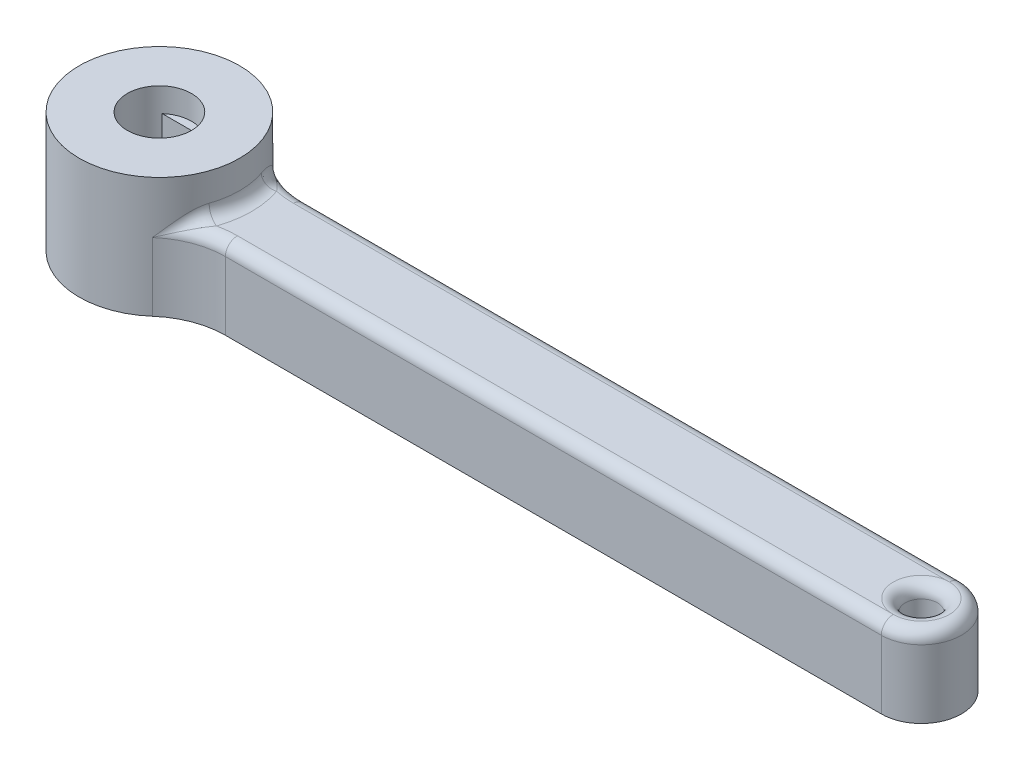
ISO-10303-21;
HEADER;
FILE_DESCRIPTION(('STEP AP214'),'2;1');
FILE_NAME('part.step','',(''),(''),'','','');
FILE_SCHEMA(('AUTOMOTIVE_DESIGN { 1 0 10303 214 1 1 1 1 }'));
ENDSEC;
DATA;
#1=APPLICATION_CONTEXT('core data for automotive mechanical design processes');
#2=APPLICATION_PROTOCOL_DEFINITION('international standard','automotive_design',2000,#1);
#3=PRODUCT_CONTEXT('',#1,'mechanical');
#4=PRODUCT('Part','Part','',(#3));
#5=PRODUCT_RELATED_PRODUCT_CATEGORY('part','',(#4));
#6=PRODUCT_DEFINITION_FORMATION('','',#4);
#7=PRODUCT_DEFINITION_CONTEXT('part definition',#1,'design');
#8=PRODUCT_DEFINITION('design','',#6,#7);
#9=PRODUCT_DEFINITION_SHAPE('','',#8);
#10=(LENGTH_UNIT() NAMED_UNIT(*) SI_UNIT(.MILLI.,.METRE.));
#11=(NAMED_UNIT(*) PLANE_ANGLE_UNIT() SI_UNIT($,.RADIAN.));
#12=(NAMED_UNIT(*) SI_UNIT($,.STERADIAN.) SOLID_ANGLE_UNIT());
#13=UNCERTAINTY_MEASURE_WITH_UNIT(LENGTH_MEASURE(1.E-05),#10,'distance_accuracy_value','');
#14=(GEOMETRIC_REPRESENTATION_CONTEXT(3) GLOBAL_UNCERTAINTY_ASSIGNED_CONTEXT((#13)) GLOBAL_UNIT_ASSIGNED_CONTEXT((#10,
#11,#12)) REPRESENTATION_CONTEXT('',''));
#15=CARTESIAN_POINT('',(0.,0.,0.));
#16=DIRECTION('',(0.,0.,1.));
#17=DIRECTION('',(1.,0.,0.));
#18=AXIS2_PLACEMENT_3D('',#15,#16,#17);
#19=CARTESIAN_POINT('',(0.,10.,-3.));
#20=DIRECTION('',(0.,0.,1.));
#21=DIRECTION('',(1.,0.,0.));
#22=AXIS2_PLACEMENT_3D('',#19,#20,#21);
#23=PLANE('',#22);
#24=DIRECTION('',(0.,-1.,0.));
#25=VECTOR('',#24,1.);
#26=CARTESIAN_POINT('',(2.64575131106459,10.,-3.));
#27=LINE('',#26,#25);
#28=CARTESIAN_POINT('',(2.64575131106459,12.,-3.));
#29=VERTEX_POINT('',#28);
#30=CARTESIAN_POINT('',(2.64575131106459,0.,-3.));
#31=VERTEX_POINT('',#30);
#32=EDGE_CURVE('E136',#29,#31,#27,.T.);
#33=ORIENTED_EDGE('',*,*,#32,.F.);
#34=DIRECTION('',(-1.,0.,0.));
#35=VECTOR('',#34,1.);
#36=CARTESIAN_POINT('',(0.,12.,-3.));
#37=LINE('',#36,#35);
#38=CARTESIAN_POINT('',(-2.64575131106459,12.,-3.));
#39=VERTEX_POINT('',#38);
#40=EDGE_CURVE('E123',#29,#39,#37,.T.);
#41=ORIENTED_EDGE('',*,*,#40,.T.);
#42=DIRECTION('',(0.,-1.,0.));
#43=VECTOR('',#42,1.);
#44=CARTESIAN_POINT('',(-2.64575131106459,10.,-3.));
#45=LINE('',#44,#43);
#46=CARTESIAN_POINT('',(-2.64575131106459,0.,-3.));
#47=VERTEX_POINT('',#46);
#48=EDGE_CURVE('E138',#39,#47,#45,.T.);
#49=ORIENTED_EDGE('',*,*,#48,.T.);
#50=DIRECTION('',(-1.,0.,0.));
#51=VECTOR('',#50,1.);
#52=CARTESIAN_POINT('',(0.,0.,-3.));
#53=LINE('',#52,#51);
#54=EDGE_CURVE('E141',#31,#47,#53,.T.);
#55=ORIENTED_EDGE('',*,*,#54,.F.);
#56=EDGE_LOOP('',(#33,#41,#49,#55));
#57=FACE_BOUND('',#56,.T.);
#58=ADVANCED_FACE('F35',(#57),#23,.T.);
#59=CARTESIAN_POINT('',(13.228756555323,10.,-15.));
#60=DIRECTION('',(0.,-1.,0.));
#61=DIRECTION('',(0.,0.,-1.));
#62=AXIS2_PLACEMENT_3D('',#59,#60,#61);
#63=PLANE('',#62);
#64=CARTESIAN_POINT('',(0.,10.,0.));
#65=DIRECTION('',(0.,-1.,0.));
#66=DIRECTION('',(0.,0.,-1.));
#67=AXIS2_PLACEMENT_3D('',#64,#65,#66);
#68=CIRCLE('',#67,11.5);
#69=CARTESIAN_POINT('',(10.8735595370117,10.,-3.74375519967082));
#70=VERTEX_POINT('',#69);
#71=CARTESIAN_POINT('',(10.8735595370117,10.,3.74375519967082));
#72=VERTEX_POINT('',#71);
#73=EDGE_CURVE('E188',#70,#72,#68,.T.);
#74=ORIENTED_EDGE('',*,*,#73,.T.);
#75=CARTESIAN_POINT('',(13.228756555323,10.,15.));
#76=DIRECTION('',(0.,-1.,0.));
#77=DIRECTION('',(0.,0.,-1.));
#78=AXIS2_PLACEMENT_3D('',#75,#76,#77);
#79=CIRCLE('',#78,11.5);
#80=CARTESIAN_POINT('',(13.228756555323,10.,3.5));
#81=VERTEX_POINT('',#80);
#82=EDGE_CURVE('E190',#72,#81,#79,.T.);
#83=ORIENTED_EDGE('',*,*,#82,.T.);
#84=DIRECTION('',(1.,0.,0.));
#85=VECTOR('',#84,1.);
#86=CARTESIAN_POINT('',(13.228756555323,10.,3.5));
#87=LINE('',#86,#85);
#88=CARTESIAN_POINT('',(95.,10.,3.5));
#89=VERTEX_POINT('',#88);
#90=EDGE_CURVE('E181',#81,#89,#87,.T.);
#91=ORIENTED_EDGE('',*,*,#90,.T.);
#92=CARTESIAN_POINT('',(95.,10.,0.));
#93=DIRECTION('',(0.,-1.,0.));
#94=DIRECTION('',(0.,0.,-1.));
#95=AXIS2_PLACEMENT_3D('',#92,#93,#94);
#96=CIRCLE('',#95,3.5);
#97=CARTESIAN_POINT('',(95.,10.,-3.5));
#98=VERTEX_POINT('',#97);
#99=EDGE_CURVE('E179',#89,#98,#96,.T.);
#100=ORIENTED_EDGE('',*,*,#99,.T.);
#101=DIRECTION('',(-1.,0.,0.));
#102=VECTOR('',#101,1.);
#103=CARTESIAN_POINT('',(13.228756555323,10.,-3.5));
#104=LINE('',#103,#102);
#105=CARTESIAN_POINT('',(13.228756555323,10.,-3.5));
#106=VERTEX_POINT('',#105);
#107=EDGE_CURVE('E183',#98,#106,#104,.T.);
#108=ORIENTED_EDGE('',*,*,#107,.T.);
#109=CARTESIAN_POINT('',(13.228756555323,10.,-15.));
#110=DIRECTION('',(0.,-1.,0.));
#111=DIRECTION('',(0.,0.,-1.));
#112=AXIS2_PLACEMENT_3D('',#109,#110,#111);
#113=CIRCLE('',#112,11.5);
#114=EDGE_CURVE('E185',#106,#70,#113,.T.);
#115=ORIENTED_EDGE('',*,*,#114,.T.);
#116=EDGE_LOOP('',(#74,#83,#91,#100,#108,#115));
#117=FACE_BOUND('',#116,.T.);
#118=ADVANCED_FACE('F276',(#117),#63,.F.);
#119=CARTESIAN_POINT('',(13.228756555323,0.,-15.));
#120=DIRECTION('',(0.,-1.,0.));
#121=DIRECTION('',(0.,0.,-1.));
#122=AXIS2_PLACEMENT_3D('',#119,#120,#121);
#123=PLANE('',#122);
#124=CARTESIAN_POINT('',(0.,0.,0.));
#125=DIRECTION('',(0.,1.,0.));
#126=DIRECTION('',(0.,0.,1.));
#127=AXIS2_PLACEMENT_3D('',#124,#125,#126);
#128=CIRCLE('',#127,4.);
#129=EDGE_CURVE('E143',#47,#31,#128,.T.);
#130=ORIENTED_EDGE('',*,*,#129,.T.);
#131=ORIENTED_EDGE('',*,*,#54,.T.);
#132=EDGE_LOOP('',(#130,#131));
#133=FACE_BOUND('',#132,.T.);
#134=CARTESIAN_POINT('',(13.228756555323,0.,-15.));
#135=DIRECTION('',(0.,-1.,0.));
#136=DIRECTION('',(0.,0.,-1.));
#137=AXIS2_PLACEMENT_3D('',#134,#135,#136);
#138=CIRCLE('',#137,10.);
#139=CARTESIAN_POINT('',(13.228756555323,0.,-5.));
#140=VERTEX_POINT('',#139);
#141=CARTESIAN_POINT('',(6.61437827766148,0.,-7.5));
#142=VERTEX_POINT('',#141);
#143=EDGE_CURVE('E145',#140,#142,#138,.T.);
#144=ORIENTED_EDGE('',*,*,#143,.F.);
#145=DIRECTION('',(-1.,0.,0.));
#146=VECTOR('',#145,1.);
#147=CARTESIAN_POINT('',(13.228756555323,0.,-5.));
#148=LINE('',#147,#146);
#149=CARTESIAN_POINT('',(95.,0.,-5.));
#150=VERTEX_POINT('',#149);
#151=EDGE_CURVE('E164',#150,#140,#148,.T.);
#152=ORIENTED_EDGE('',*,*,#151,.F.);
#153=CARTESIAN_POINT('',(95.,0.,0.));
#154=DIRECTION('',(0.,1.,0.));
#155=DIRECTION('',(0.,0.,1.));
#156=AXIS2_PLACEMENT_3D('',#153,#154,#155);
#157=CIRCLE('',#156,5.);
#158=CARTESIAN_POINT('',(95.,0.,5.));
#159=VERTEX_POINT('',#158);
#160=EDGE_CURVE('E161',#159,#150,#157,.T.);
#161=ORIENTED_EDGE('',*,*,#160,.F.);
#162=DIRECTION('',(1.,0.,0.));
#163=VECTOR('',#162,1.);
#164=CARTESIAN_POINT('',(13.228756555323,0.,5.));
#165=LINE('',#164,#163);
#166=CARTESIAN_POINT('',(13.228756555323,0.,5.));
#167=VERTEX_POINT('',#166);
#168=EDGE_CURVE('E158',#167,#159,#165,.T.);
#169=ORIENTED_EDGE('',*,*,#168,.F.);
#170=CARTESIAN_POINT('',(13.228756555323,0.,15.));
#171=DIRECTION('',(0.,-1.,0.));
#172=DIRECTION('',(0.,0.,1.));
#173=AXIS2_PLACEMENT_3D('',#170,#171,#172);
#174=CIRCLE('',#173,10.);
#175=CARTESIAN_POINT('',(6.61437827766148,0.,7.5));
#176=VERTEX_POINT('',#175);
#177=EDGE_CURVE('E155',#176,#167,#174,.T.);
#178=ORIENTED_EDGE('',*,*,#177,.F.);
#179=CARTESIAN_POINT('',(0.,0.,0.));
#180=DIRECTION('',(0.,1.,0.));
#181=DIRECTION('',(0.,0.,1.));
#182=AXIS2_PLACEMENT_3D('',#179,#180,#181);
#183=CIRCLE('',#182,10.);
#184=EDGE_CURVE('E152',#142,#176,#183,.T.);
#185=ORIENTED_EDGE('',*,*,#184,.F.);
#186=EDGE_LOOP('',(#144,#152,#161,#169,#178,#185));
#187=FACE_BOUND('',#186,.T.);
#188=CARTESIAN_POINT('',(95.,0.,0.));
#189=DIRECTION('',(0.,1.,0.));
#190=DIRECTION('',(0.,0.,1.));
#191=AXIS2_PLACEMENT_3D('',#188,#189,#190);
#192=CIRCLE('',#191,2.);
#193=CARTESIAN_POINT('',(95.,0.,2.));
#194=VERTEX_POINT('',#193);
#195=EDGE_CURVE('E519',#194,#194,#192,.T.);
#196=ORIENTED_EDGE('',*,*,#195,.T.);
#197=EDGE_LOOP('',(#196));
#198=FACE_BOUND('',#197,.T.);
#199=ADVANCED_FACE('F281',(#133,#187,#198),#123,.T.);
#200=CARTESIAN_POINT('',(13.228756555323,10.,-15.));
#201=DIRECTION('',(0.,-1.,0.));
#202=DIRECTION('',(0.,0.,-1.));
#203=AXIS2_PLACEMENT_3D('',#200,#201,#202);
#204=CYLINDRICAL_SURFACE('',#203,10.);
#205=DIRECTION('',(0.,-1.,0.));
#206=VECTOR('',#205,1.);
#207=CARTESIAN_POINT('',(6.61437827766148,10.,-7.5));
#208=LINE('',#207,#206);
#209=CARTESIAN_POINT('',(6.61437827766148,8.5,-7.5));
#210=VERTEX_POINT('',#209);
#211=EDGE_CURVE('E177',#210,#142,#208,.T.);
#212=ORIENTED_EDGE('',*,*,#211,.F.);
#213=CARTESIAN_POINT('',(13.228756555323,8.5,-15.));
#214=DIRECTION('',(0.,-1.,0.));
#215=DIRECTION('',(0.,0.,-1.));
#216=AXIS2_PLACEMENT_3D('',#213,#214,#215);
#217=CIRCLE('',#216,10.);
#218=CARTESIAN_POINT('',(13.228756555323,8.5,-5.));
#219=VERTEX_POINT('',#218);
#220=EDGE_CURVE('E192',#210,#219,#217,.F.);
#221=ORIENTED_EDGE('',*,*,#220,.T.);
#222=DIRECTION('',(0.,-1.,0.));
#223=VECTOR('',#222,1.);
#224=CARTESIAN_POINT('',(13.228756555323,10.,-5.));
#225=LINE('',#224,#223);
#226=EDGE_CURVE('E167',#219,#140,#225,.T.);
#227=ORIENTED_EDGE('',*,*,#226,.T.);
#228=ORIENTED_EDGE('',*,*,#143,.T.);
#229=EDGE_LOOP('',(#212,#221,#227,#228));
#230=FACE_BOUND('',#229,.T.);
#231=ADVANCED_FACE('F227',(#230),#204,.F.);
#232=CARTESIAN_POINT('',(0.,10.,0.));
#233=DIRECTION('',(0.,-1.,0.));
#234=DIRECTION('',(0.,0.,-1.));
#235=AXIS2_PLACEMENT_3D('',#232,#233,#234);
#236=CYLINDRICAL_SURFACE('',#235,10.);
#237=ORIENTED_EDGE('',*,*,#184,.T.);
#238=DIRECTION('',(0.,-1.,0.));
#239=VECTOR('',#238,1.);
#240=CARTESIAN_POINT('',(6.61437827766148,10.,7.5));
#241=LINE('',#240,#239);
#242=CARTESIAN_POINT('',(6.61437827766148,8.5,7.5));
#243=VERTEX_POINT('',#242);
#244=EDGE_CURVE('E175',#243,#176,#241,.T.);
#245=ORIENTED_EDGE('',*,*,#244,.F.);
#246=CARTESIAN_POINT('',(11.2666017491464,9.91495301389648,3.16363068020147));
#247=CARTESIAN_POINT('',(9.60383533741742,9.70558153798238,2.83615665246423));
#248=CARTESIAN_POINT('',(9.72623814438429,11.3299060277929,2.32385274032673));
#249=CARTESIAN_POINT('',(11.2401766679997,9.92961195994438,3.21022653387549));
#250=CARTESIAN_POINT('',(9.5934225228478,9.73193173801819,2.8619302368106));
#251=CARTESIAN_POINT('',(9.70798176760596,11.359223920098,2.40029479531077));
#252=CARTESIAN_POINT('',(11.2121051153606,9.94229316127615,3.25751779042132));
#253=CARTESIAN_POINT('',(9.58275561965332,9.75839649797961,2.88978959410323));
#254=CARTESIAN_POINT('',(9.68856287944467,11.3845863227896,2.47754895146159));
#255=CARTESIAN_POINT('',(11.1527017363609,9.96380623569272,3.3531514063932));
#256=CARTESIAN_POINT('',(9.56053026795809,9.81067201339155,2.95016432329738));
#257=CARTESIAN_POINT('',(9.64747820806291,11.4276124715463,2.63298087808854));
#258=CARTESIAN_POINT('',(11.1213736036053,9.97264241203457,3.40149252686437));
#259=CARTESIAN_POINT('',(9.54900086733379,9.8364453692838,2.98257567376002));
#260=CARTESIAN_POINT('',(9.62581497046961,11.4452848241255,2.71115751493644));
#261=CARTESIAN_POINT('',(11.0230948939794,9.99345006806851,3.54680134262617));
#262=CARTESIAN_POINT('',(9.51289010398608,9.91093403917013,3.08629642010413));
#263=CARTESIAN_POINT('',(9.55794949531334,11.4869001360254,2.94477148790968));
#264=CARTESIAN_POINT('',(10.9513401590276,9.99999781836562,3.64496353683036));
#265=CARTESIAN_POINT('',(9.4863870403045,9.95806897948052,3.1650876047712));
#266=CARTESIAN_POINT('',(9.50851713091805,11.4999956366968,3.10078955610885));
#267=CARTESIAN_POINT('',(10.768256765925,10.000002953591,3.87750362682057));
#268=CARTESIAN_POINT('',(9.41448302810702,10.0549588972745,3.37386307954706));
#269=CARTESIAN_POINT('',(9.3831797594833,11.5000059072286,3.46481082340919));
#270=CARTESIAN_POINT('',(10.6519091971764,9.98800858949365,4.01240580173363));
#271=CARTESIAN_POINT('',(9.36601439745922,10.1006608022543,3.51143659714213));
#272=CARTESIAN_POINT('',(9.30409676807958,11.4760171790019,3.67167436009835));
#273=CARTESIAN_POINT('',(10.399920318718,9.94462431473028,4.28281385096631));
#274=CARTESIAN_POINT('',(9.24934169654064,10.1592917718864,3.81445545125666));
#275=CARTESIAN_POINT('',(9.13469671892804,11.3892486294458,4.07499574365977));
#276=CARTESIAN_POINT('',(10.2641931504259,9.91314589409735,4.41831966276063));
#277=CARTESIAN_POINT('',(9.18201913149753,10.1732791794624,3.97843374610425));
#278=CARTESIAN_POINT('',(9.04432990620065,11.3262917881827,4.27140163788822));
#279=CARTESIAN_POINT('',(10.0130754192512,9.84493591684648,4.65568255495537));
#280=CARTESIAN_POINT('',(9.04686844990893,10.1667762126619,4.27846685053718));
#281=CARTESIAN_POINT('',(8.87879439709283,11.189871833702,4.60352545638044));
#282=CARTESIAN_POINT('',(9.90096904968649,9.81143425812025,4.75756471676605));
#283=CARTESIAN_POINT('',(8.98416259888666,10.1546759861723,4.41001577276213));
#284=CARTESIAN_POINT('',(8.80540182083503,11.1228685162638,4.74222993948706));
#285=CARTESIAN_POINT('',(9.66954625482123,9.73760361563571,4.96179693737507));
#286=CARTESIAN_POINT('',(8.84927681175192,10.1121824460805,4.67557882221507));
#287=CARTESIAN_POINT('',(8.65475090772161,10.9752072312922,5.01190081098086));
#288=CARTESIAN_POINT('',(9.55022563147789,9.69727063159205,5.06414723593843));
#289=CARTESIAN_POINT('',(8.77727391645401,10.0822600878841,4.80968341089805));
#290=CARTESIAN_POINT('',(8.57749032462077,10.8945412631881,5.14286260443706));
#291=CARTESIAN_POINT('',(9.30572215280582,9.61114241667934,5.26990873307289));
#292=CARTESIAN_POINT('',(8.6249954652128,10.006438047626,5.07699048945801));
#293=CARTESIAN_POINT('',(8.4196877141212,10.7222848333547,5.39734321809236));
#294=CARTESIAN_POINT('',(9.18053254439287,9.56534079479477,5.37332104125663));
#295=CARTESIAN_POINT('',(8.54476250955111,9.96084417354252,5.21048836940493));
#296=CARTESIAN_POINT('',(8.33914192120039,10.6306815895944,5.52085307074181));
#297=CARTESIAN_POINT('',(8.92571073286261,9.46945963753885,5.58169770756392));
#298=CARTESIAN_POINT('',(8.37725293766325,9.85641412606066,5.4742286748898));
#299=CARTESIAN_POINT('',(8.17522806426966,10.4389192750846,5.76079503505607));
#300=CARTESIAN_POINT('',(8.79607715757083,9.41937877360002,5.68666253927132));
#301=CARTESIAN_POINT('',(8.28991227855946,9.79773074410292,5.60488428474268));
#302=CARTESIAN_POINT('',(8.0918591286497,10.3387575472,5.87722492927646));
#303=CARTESIAN_POINT('',(8.49895174598038,9.3022435736745,5.9266517246919));
#304=CARTESIAN_POINT('',(8.08577050240434,9.65325450366343,5.8947815256855));
#305=CARTESIAN_POINT('',(7.90015051692102,10.1044871473493,6.13348000571147));
#306=CARTESIAN_POINT('',(8.33051099765859,9.23420199901066,6.06228726926262));
#307=CARTESIAN_POINT('',(7.96634848651588,9.56394213285387,6.05422137159255));
#308=CARTESIAN_POINT('',(7.79103572708455,9.96840399803314,6.27135349711884));
#309=CARTESIAN_POINT('',(7.99088399746438,9.09445985758026,6.33753943557137));
#310=CARTESIAN_POINT('',(7.71928734865612,9.3735044974369,6.36417593973263));
#311=CARTESIAN_POINT('',(7.56874046578026,9.68891971517854,6.53791171621562));
#312=CARTESIAN_POINT('',(7.81969704871188,9.02275835166054,6.47715707503443));
#313=CARTESIAN_POINT('',(7.59112650460776,9.27207393956219,6.5156852075311));
#314=CARTESIAN_POINT('',(7.45555895300329,9.54551670333371,6.66659406488941));
#315=CARTESIAN_POINT('',(7.476935985964,8.87714929410129,6.76038557418335));
#316=CARTESIAN_POINT('',(7.32768628367128,9.0621031100478,6.8091272430167));
#317=CARTESIAN_POINT('',(7.22506129063414,9.25429858820684,6.91572493111843));
#318=CARTESIAN_POINT('',(7.30536265911413,8.8032447157388,6.9039910354209));
#319=CARTESIAN_POINT('',(7.19174839430747,8.95305715307028,6.95202723042266));
#320=CARTESIAN_POINT('',(7.10775067817481,9.10648943147884,7.0361838831368));
#321=CARTESIAN_POINT('',(6.96344465561805,8.65433099932777,7.19504251538003));
#322=CARTESIAN_POINT('',(6.91310223270351,8.73182069982276,7.22842419961927));
#323=CARTESIAN_POINT('',(6.86838457172053,8.80866199865466,7.27002607894705));
#324=CARTESIAN_POINT('',(6.79309969395794,8.57932213065084,7.34248760402631));
#325=CARTESIAN_POINT('',(6.76960463126202,8.61898927207863,7.36280694124149));
#326=CARTESIAN_POINT('',(6.74633022333999,8.65864426130166,7.38341101409584));
#327=CARTESIAN_POINT('',(6.62085312697109,8.50287436965144,7.49429067824395));
#328=CARTESIAN_POINT('',(6.62000680966255,8.50431155831825,7.49503335741988));
#329=CARTESIAN_POINT('',(6.61916267160728,8.50574873930287,7.49577852016408));
#330=CARTESIAN_POINT('',(6.61761545437999,8.50143718317223,7.49714506455878));
#331=CARTESIAN_POINT('',(6.61719322497346,8.50215577625914,7.4975174602684));
#332=CARTESIAN_POINT('',(6.61677097553105,8.50287436634446,7.4978898331895));
#333=CARTESIAN_POINT('',(6.61437827766148,8.5,7.5));
#334=CARTESIAN_POINT('',(6.61437827766148,8.5,7.5));
#335=CARTESIAN_POINT('',(6.61437827766148,8.5,7.5));
#336=(BOUNDED_SURFACE() B_SPLINE_SURFACE(3,2,((#246,#247,#248),(#249,#250,#251),(#252,#253,
#254),(#255,#256,#257),(#258,#259,#260),(#261,#262,#263),(#264,#265,#266),(#267,#268,#269),
(#270,#271,#272),(#273,#274,#275),(#276,#277,#278),(#279,#280,#281),(#282,#283,#284),(#285,#286,
#287),(#288,#289,#290),(#291,#292,#293),(#294,#295,#296),(#297,#298,#299),(#300,#301,#302),
(#303,#304,#305),(#306,#307,#308),(#309,#310,#311),(#312,#313,#314),(#315,#316,#317),(#318,#319,
#320),(#321,#322,#323),(#324,#325,#326),(#327,#328,#329),(#330,#331,#332),(#333,#334,#335)),
.UNSPECIFIED.,.F.,.F.,.F.) B_SPLINE_SURFACE_WITH_KNOTS((4,2,2,2,2,2,2,2,2,2,2,2,2,2,4),(3,3),
(0.,0.284850960250055,0.569382297228323,1.13295612333657,1.89594675086017,2.6624291045899,
3.23915201955202,3.81621382678932,4.39395675231311,4.97187970480752,5.70257669237804,
6.43346213168582,7.16340223483389,7.89316713931814,7.9071492717644),(0.,1.),
.UNSPECIFIED.) GEOMETRIC_REPRESENTATION_ITEM() RATIONAL_B_SPLINE_SURFACE(((1.,0.65996304149796,
1.),(1.,0.662807524716242,1.),(1.,0.665954146647557,1.),(1.,0.672815857289572,1.),(1.,
0.676530304177905,1.),(1.,0.688405564803017,1.),(1.,0.697354451661916,1.),(1.,0.720309906809323,
1.),(1.,0.734985655729148,1.),(1.,0.765784531882767,1.),(1.,0.781913975496577,1.),(1.,
0.810146500386813,1.),(1.,0.822257792746757,1.),(1.,0.84599368118779,1.),(1.,0.857617987095844,
1.),(1.,0.879995525867495,1.),(1.,0.890747714390612,1.),(1.,0.911067416364281,1.),(1.,
0.920634559621411,1.),(1.,0.940685950867867,1.),(1.,0.950744073961595,1.),(1.,0.968234446589037,
1.),(1.,0.975666018223023,1.),(1.,0.987659498342382,1.),(1.,0.992225106052753,1.),(1.,
0.998365132009109,1.),(1.,0.999940267930979,1.),(1.,0.99999944585465,1.),(1.,1.00000000146271,
1.),(1.,1.,1.))) REPRESENTATION_ITEM('') SURFACE());
#337=CARTESIAN_POINT('',(9.72623814438429,11.3299060277929,2.32385274032673));
#338=CARTESIAN_POINT('',(9.70798176760596,11.359223920098,2.40029479531077));
#339=CARTESIAN_POINT('',(9.68856287944467,11.3845863227896,2.47754895146159));
#340=CARTESIAN_POINT('',(9.64747820806291,11.4276124715463,2.63298087808854));
#341=CARTESIAN_POINT('',(9.62581497046961,11.4452848241255,2.71115751493644));
#342=CARTESIAN_POINT('',(9.55794949531334,11.4869001360254,2.94477148790968));
#343=CARTESIAN_POINT('',(9.50851713091805,11.4999956366968,3.10078955610885));
#344=CARTESIAN_POINT('',(9.3831797594833,11.5000059072286,3.46481082340919));
#345=CARTESIAN_POINT('',(9.30409676807958,11.4760171790019,3.67167436009835));
#346=CARTESIAN_POINT('',(9.13469671892804,11.3892486294458,4.07499574365977));
#347=CARTESIAN_POINT('',(9.04432990620065,11.3262917881827,4.27140163788822));
#348=CARTESIAN_POINT('',(8.87879439709283,11.189871833702,4.60352545638044));
#349=CARTESIAN_POINT('',(8.80540182083504,11.1228685162638,4.74222993948706));
#350=CARTESIAN_POINT('',(8.65475090772161,10.9752072312922,5.01190081098086));
#351=CARTESIAN_POINT('',(8.57749032462077,10.8945412631881,5.14286260443706));
#352=CARTESIAN_POINT('',(8.4196877141212,10.7222848333547,5.39734321809236));
#353=CARTESIAN_POINT('',(8.33914192120039,10.6306815895944,5.52085307074181));
#354=CARTESIAN_POINT('',(8.17522806426966,10.4389192750846,5.76079503505607));
#355=CARTESIAN_POINT('',(8.0918591286497,10.3387575472,5.87722492927646));
#356=CARTESIAN_POINT('',(7.90015051692102,10.1044871473493,6.13348000571147));
#357=CARTESIAN_POINT('',(7.79103572708455,9.96840399803314,6.27135349711884));
#358=CARTESIAN_POINT('',(7.56874046578026,9.68891971517854,6.53791171621562));
#359=CARTESIAN_POINT('',(7.45555895300329,9.54551670333371,6.66659406488941));
#360=CARTESIAN_POINT('',(7.22506129063413,9.25429858820684,6.91572493111843));
#361=CARTESIAN_POINT('',(7.10775067817481,9.10648943147885,7.0361838831368));
#362=CARTESIAN_POINT('',(6.86838457172053,8.80866199865466,7.27002607894705));
#363=CARTESIAN_POINT('',(6.74633022334001,8.65864426130165,7.38341101409584));
#364=CARTESIAN_POINT('',(6.61916267160728,8.50574873930287,7.49577852016408));
#365=CARTESIAN_POINT('',(6.61677097553105,8.50287436634446,7.4978898331895));
#366=CARTESIAN_POINT('',(6.61437827766148,8.5,7.5));
#367=B_SPLINE_CURVE_WITH_KNOTS('',3,(#337,#338,#339,#340,#341,#342,#343,#344,#345,#346,#347,
#348,#349,#350,#351,#352,#353,#354,#355,#356,#357,#358,#359,#360,#361,#362,#363,#364,#365,#366),
.UNSPECIFIED.,.F.,.F.,(4,2,2,2,2,2,2,2,2,2,2,2,2,2,4),(0.,0.284850960250055,0.569382297228323,
1.13295612333657,1.89594675086017,2.6624291045899,3.23915201955202,3.81621382678932,
4.39395675231311,4.97187970480752,5.70257669237804,6.43346213168582,7.16340223483389,
7.89316713931814,7.9071492717644),.UNSPECIFIED.);
#368=CARTESIAN_POINT('',(9.45526916261885,11.5,3.25543930406158));
#369=VERTEX_POINT('',#368);
#370=EDGE_CURVE('E44',#243,#369,#367,.F.);
#371=ORIENTED_EDGE('',*,*,#370,.T.);
#372=CARTESIAN_POINT('',(0.,11.5,0.));
#373=DIRECTION('',(0.,-1.,0.));
#374=DIRECTION('',(0.,0.,-1.));
#375=AXIS2_PLACEMENT_3D('',#372,#373,#374);
#376=CIRCLE('',#375,10.);
#377=CARTESIAN_POINT('',(9.45526916261885,11.5,-3.25543930406158));
#378=VERTEX_POINT('',#377);
#379=EDGE_CURVE('E51',#369,#378,#376,.F.);
#380=ORIENTED_EDGE('',*,*,#379,.T.);
#381=CARTESIAN_POINT('',(9.72623814438429,11.3299060277929,-2.32385274032673));
#382=CARTESIAN_POINT('',(9.60383533741742,9.70558153798238,-2.83615665246423));
#383=CARTESIAN_POINT('',(11.2666017491464,9.91495301389648,-3.16363068020147));
#384=CARTESIAN_POINT('',(9.70798176760596,11.359223920098,-2.40029479531079));
#385=CARTESIAN_POINT('',(9.5934225228478,9.73193173801819,-2.86193023681061));
#386=CARTESIAN_POINT('',(11.2401766679997,9.92961195994439,-3.2102265338755));
#387=CARTESIAN_POINT('',(9.68856287944466,11.3845863227897,-2.47754895146163));
#388=CARTESIAN_POINT('',(9.58275561965332,9.75839649797962,-2.88978959410324));
#389=CARTESIAN_POINT('',(11.2121051153606,9.94229316127615,-3.25751779042133));
#390=CARTESIAN_POINT('',(9.64747820806289,11.4276124715463,-2.6329808780886));
#391=CARTESIAN_POINT('',(9.56053026795808,9.81067201339157,-2.9501643232974));
#392=CARTESIAN_POINT('',(11.1527017363608,9.96380623569273,-3.35315140639324));
#393=CARTESIAN_POINT('',(9.62581497046959,11.4452848241255,-2.71115751493652));
#394=CARTESIAN_POINT('',(9.54900086733378,9.83644536928382,-2.98257567376006));
#395=CARTESIAN_POINT('',(11.1213736036053,9.97264241203457,-3.40149252686442));
#396=CARTESIAN_POINT('',(9.55794949531332,11.4869001360254,-2.94477148790974));
#397=CARTESIAN_POINT('',(9.51289010398607,9.91093403917015,-3.08629642010416));
#398=CARTESIAN_POINT('',(11.0230948939794,9.99345006806852,-3.54680134262621));
#399=CARTESIAN_POINT('',(9.50851713091804,11.4999956366968,-3.10078955610888));
#400=CARTESIAN_POINT('',(9.4863870403045,9.95806897948053,-3.16508760477122));
#401=CARTESIAN_POINT('',(10.9513401590276,9.99999781836562,-3.64496353683038));
#402=CARTESIAN_POINT('',(9.38317975948332,11.5000059072286,-3.46481082340916));
#403=CARTESIAN_POINT('',(9.41448302810703,10.0549588972745,-3.37386307954704));
#404=CARTESIAN_POINT('',(10.768256765925,10.000002953591,-3.87750362682055));
#405=CARTESIAN_POINT('',(9.30409676807961,11.476017179002,-3.67167436009829));
#406=CARTESIAN_POINT('',(9.36601439745923,10.1006608022543,-3.51143659714208));
#407=CARTESIAN_POINT('',(10.6519091971765,9.98800858949365,-4.01240580173359));
#408=CARTESIAN_POINT('',(9.13469671892807,11.3892486294459,-4.07499574365971));
#409=CARTESIAN_POINT('',(9.24934169654066,10.1592917718864,-3.81445545125661));
#410=CARTESIAN_POINT('',(10.399920318718,9.94462431473029,-4.28281385096627));
#411=CARTESIAN_POINT('',(9.04432990620066,11.3262917881827,-4.27140163788819));
#412=CARTESIAN_POINT('',(9.18201913149754,10.1732791794624,-3.97843374610422));
#413=CARTESIAN_POINT('',(10.2641931504259,9.91314589409736,-4.41831966276061));
#414=CARTESIAN_POINT('',(8.87879439709281,11.189871833702,-4.60352545638048));
#415=CARTESIAN_POINT('',(9.04686844990892,10.1667762126619,-4.27846685053721));
#416=CARTESIAN_POINT('',(10.0130754192511,9.84493591684648,-4.6556825549554));
#417=CARTESIAN_POINT('',(8.80540182083499,11.1228685162638,-4.74222993948714));
#418=CARTESIAN_POINT('',(8.98416259888663,10.1546759861722,-4.4100157727622));
#419=CARTESIAN_POINT('',(9.90096904968643,9.81143425812023,-4.7575647167661));
#420=CARTESIAN_POINT('',(8.65475090772153,10.9752072312921,-5.011900810981));
#421=CARTESIAN_POINT('',(8.84927681175185,10.1121824460805,-4.67557882221521));
#422=CARTESIAN_POINT('',(9.66954625482111,9.73760361563567,-4.96179693737518));
#423=CARTESIAN_POINT('',(8.57749032462067,10.894541263188,-5.14286260443723));
#424=CARTESIAN_POINT('',(8.77727391645392,10.0822600878841,-4.80968341089822));
#425=CARTESIAN_POINT('',(9.55022563147774,9.697270631592,-5.06414723593856));
#426=CARTESIAN_POINT('',(8.4196877141211,10.7222848333546,-5.39734321809252));
#427=CARTESIAN_POINT('',(8.6249954652127,10.0064380476259,-5.07699048945818));
#428=CARTESIAN_POINT('',(9.30572215280566,9.61114241667928,-5.26990873307302));
#429=CARTESIAN_POINT('',(8.33914192120031,10.6306815895944,-5.52085307074194));
#430=CARTESIAN_POINT('',(8.54476250955103,9.96084417354247,-5.21048836940507));
#431=CARTESIAN_POINT('',(9.18053254439275,9.56534079479472,-5.37332104125673));
#432=CARTESIAN_POINT('',(8.17522806426962,10.4389192750845,-5.76079503505612));
#433=CARTESIAN_POINT('',(8.37725293766321,9.85641412606063,-5.47422867488986));
#434=CARTESIAN_POINT('',(8.92571073286255,9.46945963753882,-5.58169770756397));
#435=CARTESIAN_POINT('',(8.09185912864968,10.3387575471999,-5.87722492927649));
#436=CARTESIAN_POINT('',(8.28991227855944,9.7977307441029,-5.6048842847427));
#437=CARTESIAN_POINT('',(8.79607715757081,9.4193787736,-5.68666253927134));
#438=CARTESIAN_POINT('',(7.90015051692102,10.1044871473493,-6.13348000571147));
#439=CARTESIAN_POINT('',(8.08577050240433,9.65325450366345,-5.8947815256855));
#440=CARTESIAN_POINT('',(8.49895174598038,9.30224357367451,-5.92665172469191));
#441=CARTESIAN_POINT('',(7.79103572708453,9.96840399803323,-6.27135349711885));
#442=CARTESIAN_POINT('',(7.96634848651585,9.56394213285393,-6.05422137159257));
#443=CARTESIAN_POINT('',(8.33051099765856,9.2342019990107,-6.06228726926265));
#444=CARTESIAN_POINT('',(7.56874046578035,9.68891971517851,-6.53791171621553));
#445=CARTESIAN_POINT('',(7.71928734865621,9.37350449743688,-6.36417593973253));
#446=CARTESIAN_POINT('',(7.9908839974645,9.09445985758025,-6.33753943557127));
#447=CARTESIAN_POINT('',(7.4555589530035,9.54551670333353,-6.66659406488921));
#448=CARTESIAN_POINT('',(7.59112650460801,9.27207393956204,-6.51568520753086));
#449=CARTESIAN_POINT('',(7.81969704871217,9.02275835166044,-6.47715707503418));
#450=CARTESIAN_POINT('',(7.22506129063407,9.25429858820723,-6.91572493111847));
#451=CARTESIAN_POINT('',(7.3276862836712,9.0621031100481,-6.80912724301674));
#452=CARTESIAN_POINT('',(7.47693598596392,8.87714929410148,-6.76038557418341));
#453=CARTESIAN_POINT('',(7.10775067817435,9.10648943147997,-7.03618388313719));
#454=CARTESIAN_POINT('',(7.19174839430692,8.95305715307113,-6.95202723042313));
#455=CARTESIAN_POINT('',(7.3053626591135,8.80324471573936,-6.90399103542143));
#456=CARTESIAN_POINT('',(6.86838457172111,8.80866199865367,-7.27002607894655));
#457=CARTESIAN_POINT('',(6.9131022327042,8.73182069982201,-7.22842419961868));
#458=CARTESIAN_POINT('',(6.96344465561884,8.65433099932728,-7.19504251537935));
#459=CARTESIAN_POINT('',(6.746330223342,8.65864426129782,-7.38341101409409));
#460=CARTESIAN_POINT('',(6.76960463126439,8.61898927207574,-7.36280694123942));
#461=CARTESIAN_POINT('',(6.79309969396069,8.57932213064892,-7.34248760402395));
#462=CARTESIAN_POINT('',(6.61916267160735,8.50574873930272,-7.49577852016401));
#463=CARTESIAN_POINT('',(6.62000680966263,8.50431155831814,-7.4950333574198));
#464=CARTESIAN_POINT('',(6.62085312697119,8.50287436965136,-7.49429067824386));
#465=CARTESIAN_POINT('',(6.61677097553109,8.50287436634438,-7.49788983318947));
#466=CARTESIAN_POINT('',(6.61719322497351,8.50215577625908,-7.49751746026836));
#467=CARTESIAN_POINT('',(6.61761545438004,8.50143718317219,-7.49714506455874));
#468=CARTESIAN_POINT('',(6.61437827766148,8.5,-7.5));
#469=CARTESIAN_POINT('',(6.61437827766148,8.5,-7.5));
#470=CARTESIAN_POINT('',(6.61437827766148,8.5,-7.5));
#471=(BOUNDED_SURFACE() B_SPLINE_SURFACE(3,2,((#381,#382,#383),(#384,#385,#386),(#387,#388,
#389),(#390,#391,#392),(#393,#394,#395),(#396,#397,#398),(#399,#400,#401),(#402,#403,#404),
(#405,#406,#407),(#408,#409,#410),(#411,#412,#413),(#414,#415,#416),(#417,#418,#419),(#420,#421,
#422),(#423,#424,#425),(#426,#427,#428),(#429,#430,#431),(#432,#433,#434),(#435,#436,#437),
(#438,#439,#440),(#441,#442,#443),(#444,#445,#446),(#447,#448,#449),(#450,#451,#452),(#453,#454,
#455),(#456,#457,#458),(#459,#460,#461),(#462,#463,#464),(#465,#466,#467),(#468,#469,#470)),
.UNSPECIFIED.,.F.,.F.,.F.) B_SPLINE_SURFACE_WITH_KNOTS((4,2,2,2,2,2,2,2,2,2,2,2,2,2,4),(3,3),
(0.,0.284850960250111,0.569382297228434,1.13295612333657,1.89594675086005,2.6624291045899,
3.23915201955218,3.81621382678961,4.39395675231326,4.97187970480752,5.702576692378,
6.43346213168562,7.16340223483376,7.89316713931815,7.9071492717644),(0.,1.),
.UNSPECIFIED.) GEOMETRIC_REPRESENTATION_ITEM() RATIONAL_B_SPLINE_SURFACE(((1.,0.65996304149796,
1.),(1.,0.662807524716242,1.),(1.,0.665954146647559,1.),(1.,0.672815857289575,1.),(1.,
0.676530304177909,1.),(1.,0.688405564803021,1.),(1.,0.697354451661918,1.),(1.,0.720309906809321,
1.),(1.,0.734985655729143,1.),(1.,0.765784531882762,1.),(1.,0.781913975496574,1.),(1.,
0.810146500386817,1.),(1.,0.822257792746764,1.),(1.,0.845993681187803,1.),(1.,0.857617987095859,
1.),(1.,0.879995525867509,1.),(1.,0.890747714390622,1.),(1.,0.911067416364286,1.),(1.,
0.920634559621413,1.),(1.,0.940685950867867,1.),(1.,0.950744073961594,1.),(1.,0.968234446589034,
1.),(1.,0.975666018223019,1.),(1.,0.987659498342378,1.),(1.,0.992225106052751,1.),(1.,
0.998365132009109,1.),(1.,0.999940267930979,1.),(1.,0.99999944585465,1.),(1.,1.00000000146271,
1.),(1.,1.,1.))) REPRESENTATION_ITEM('') SURFACE());
#472=CARTESIAN_POINT('',(9.72623814438429,11.3299060277929,-2.32385274032673));
#473=CARTESIAN_POINT('',(9.70798176760596,11.359223920098,-2.40029479531079));
#474=CARTESIAN_POINT('',(9.68856287944466,11.3845863227897,-2.47754895146163));
#475=CARTESIAN_POINT('',(9.64747820806289,11.4276124715463,-2.6329808780886));
#476=CARTESIAN_POINT('',(9.62581497046959,11.4452848241255,-2.71115751493652));
#477=CARTESIAN_POINT('',(9.55794949531332,11.4869001360254,-2.94477148790974));
#478=CARTESIAN_POINT('',(9.50851713091804,11.4999956366968,-3.10078955610888));
#479=CARTESIAN_POINT('',(9.38317975948332,11.5000059072286,-3.46481082340916));
#480=CARTESIAN_POINT('',(9.30409676807961,11.476017179002,-3.67167436009829));
#481=CARTESIAN_POINT('',(9.13469671892807,11.3892486294459,-4.07499574365971));
#482=CARTESIAN_POINT('',(9.04432990620067,11.3262917881827,-4.27140163788819));
#483=CARTESIAN_POINT('',(8.87879439709281,11.189871833702,-4.60352545638048));
#484=CARTESIAN_POINT('',(8.80540182083499,11.1228685162638,-4.74222993948713));
#485=CARTESIAN_POINT('',(8.65475090772153,10.9752072312921,-5.011900810981));
#486=CARTESIAN_POINT('',(8.57749032462067,10.894541263188,-5.14286260443723));
#487=CARTESIAN_POINT('',(8.4196877141211,10.7222848333546,-5.39734321809251));
#488=CARTESIAN_POINT('',(8.33914192120031,10.6306815895944,-5.52085307074194));
#489=CARTESIAN_POINT('',(8.17522806426962,10.4389192750845,-5.76079503505612));
#490=CARTESIAN_POINT('',(8.09185912864968,10.3387575471999,-5.87722492927649));
#491=CARTESIAN_POINT('',(7.90015051692102,10.1044871473493,-6.13348000571147));
#492=CARTESIAN_POINT('',(7.79103572708453,9.96840399803323,-6.27135349711885));
#493=CARTESIAN_POINT('',(7.56874046578035,9.68891971517851,-6.53791171621553));
#494=CARTESIAN_POINT('',(7.4555589530035,9.54551670333353,-6.66659406488921));
#495=CARTESIAN_POINT('',(7.22506129063407,9.25429858820723,-6.91572493111847));
#496=CARTESIAN_POINT('',(7.10775067817435,9.10648943147997,-7.03618388313719));
#497=CARTESIAN_POINT('',(6.86838457172111,8.80866199865367,-7.27002607894655));
#498=CARTESIAN_POINT('',(6.74633022334201,8.6586442612978,-7.38341101409408));
#499=CARTESIAN_POINT('',(6.61916267160735,8.50574873930272,-7.49577852016401));
#500=CARTESIAN_POINT('',(6.61677097553109,8.50287436634438,-7.49788983318947));
#501=CARTESIAN_POINT('',(6.61437827766148,8.5,-7.5));
#502=B_SPLINE_CURVE_WITH_KNOTS('',3,(#472,#473,#474,#475,#476,#477,#478,#479,#480,#481,#482,
#483,#484,#485,#486,#487,#488,#489,#490,#491,#492,#493,#494,#495,#496,#497,#498,#499,#500,#501),
.UNSPECIFIED.,.F.,.F.,(4,2,2,2,2,2,2,2,2,2,2,2,2,2,4),(0.,0.284850960250111,0.569382297228434,
1.13295612333657,1.89594675086005,2.6624291045899,3.23915201955218,3.81621382678961,
4.39395675231326,4.97187970480752,5.702576692378,6.43346213168562,7.16340223483376,
7.89316713931815,7.9071492717644),.UNSPECIFIED.);
#503=EDGE_CURVE('E11',#378,#210,#502,.T.);
#504=ORIENTED_EDGE('',*,*,#503,.T.);
#505=ORIENTED_EDGE('',*,*,#211,.T.);
#506=EDGE_LOOP('',(#237,#245,#371,#380,#504,#505));
#507=FACE_BOUND('',#506,.T.);
#508=CARTESIAN_POINT('',(0.,15.,0.));
#509=DIRECTION('',(0.,1.,0.));
#510=DIRECTION('',(0.,0.,1.));
#511=AXIS2_PLACEMENT_3D('',#508,#509,#510);
#512=CIRCLE('',#511,10.);
#513=CARTESIAN_POINT('',(0.,15.,10.));
#514=VERTEX_POINT('',#513);
#515=EDGE_CURVE('E517',#514,#514,#512,.T.);
#516=ORIENTED_EDGE('',*,*,#515,.F.);
#517=EDGE_LOOP('',(#516));
#518=FACE_BOUND('',#517,.T.);
#519=ADVANCED_FACE('F222',(#507,#518),#236,.T.);
#520=CARTESIAN_POINT('',(13.228756555323,10.,15.));
#521=DIRECTION('',(0.,-1.,0.));
#522=DIRECTION('',(0.,0.,-1.));
#523=AXIS2_PLACEMENT_3D('',#520,#521,#522);
#524=CYLINDRICAL_SURFACE('',#523,10.);
#525=DIRECTION('',(0.,-1.,0.));
#526=VECTOR('',#525,1.);
#527=CARTESIAN_POINT('',(13.228756555323,10.,5.));
#528=LINE('',#527,#526);
#529=CARTESIAN_POINT('',(13.228756555323,8.5,5.));
#530=VERTEX_POINT('',#529);
#531=EDGE_CURVE('E173',#530,#167,#528,.T.);
#532=ORIENTED_EDGE('',*,*,#531,.F.);
#533=CARTESIAN_POINT('',(13.228756555323,8.5,15.));
#534=DIRECTION('',(0.,-1.,0.));
#535=DIRECTION('',(0.,0.,-1.));
#536=AXIS2_PLACEMENT_3D('',#533,#534,#535);
#537=CIRCLE('',#536,10.);
#538=EDGE_CURVE('E201',#530,#243,#537,.F.);
#539=ORIENTED_EDGE('',*,*,#538,.T.);
#540=ORIENTED_EDGE('',*,*,#244,.T.);
#541=ORIENTED_EDGE('',*,*,#177,.T.);
#542=EDGE_LOOP('',(#532,#539,#540,#541));
#543=FACE_BOUND('',#542,.T.);
#544=ADVANCED_FACE('F226',(#543),#524,.F.);
#545=CARTESIAN_POINT('',(13.228756555323,10.,5.));
#546=DIRECTION('',(0.,0.,-1.));
#547=DIRECTION('',(-1.,0.,0.));
#548=AXIS2_PLACEMENT_3D('',#545,#546,#547);
#549=PLANE('',#548);
#550=DIRECTION('',(0.,-1.,0.));
#551=VECTOR('',#550,1.);
#552=CARTESIAN_POINT('',(95.,10.,5.));
#553=LINE('',#552,#551);
#554=CARTESIAN_POINT('',(95.,8.5,5.));
#555=VERTEX_POINT('',#554);
#556=EDGE_CURVE('E171',#555,#159,#553,.T.);
#557=ORIENTED_EDGE('',*,*,#556,.F.);
#558=DIRECTION('',(1.,0.,0.));
#559=VECTOR('',#558,1.);
#560=CARTESIAN_POINT('',(13.228756555323,8.5,5.));
#561=LINE('',#560,#559);
#562=EDGE_CURVE('E199',#555,#530,#561,.F.);
#563=ORIENTED_EDGE('',*,*,#562,.T.);
#564=ORIENTED_EDGE('',*,*,#531,.T.);
#565=ORIENTED_EDGE('',*,*,#168,.T.);
#566=EDGE_LOOP('',(#557,#563,#564,#565));
#567=FACE_BOUND('',#566,.T.);
#568=ADVANCED_FACE('F296',(#567),#549,.F.);
#569=CARTESIAN_POINT('',(95.,10.,0.));
#570=DIRECTION('',(0.,-1.,0.));
#571=DIRECTION('',(0.,0.,-1.));
#572=AXIS2_PLACEMENT_3D('',#569,#570,#571);
#573=CYLINDRICAL_SURFACE('',#572,5.);
#574=DIRECTION('',(0.,-1.,0.));
#575=VECTOR('',#574,1.);
#576=CARTESIAN_POINT('',(95.,10.,-5.));
#577=LINE('',#576,#575);
#578=CARTESIAN_POINT('',(95.,8.5,-5.));
#579=VERTEX_POINT('',#578);
#580=EDGE_CURVE('E169',#579,#150,#577,.T.);
#581=ORIENTED_EDGE('',*,*,#580,.F.);
#582=CARTESIAN_POINT('',(95.,8.5,0.));
#583=DIRECTION('',(0.,-1.,0.));
#584=DIRECTION('',(0.,0.,-1.));
#585=AXIS2_PLACEMENT_3D('',#582,#583,#584);
#586=CIRCLE('',#585,5.);
#587=EDGE_CURVE('E197',#579,#555,#586,.T.);
#588=ORIENTED_EDGE('',*,*,#587,.T.);
#589=ORIENTED_EDGE('',*,*,#556,.T.);
#590=ORIENTED_EDGE('',*,*,#160,.T.);
#591=EDGE_LOOP('',(#581,#588,#589,#590));
#592=FACE_BOUND('',#591,.T.);
#593=ADVANCED_FACE('F293',(#592),#573,.T.);
#594=CARTESIAN_POINT('',(13.228756555323,10.,-5.));
#595=DIRECTION('',(0.,0.,1.));
#596=DIRECTION('',(1.,0.,0.));
#597=AXIS2_PLACEMENT_3D('',#594,#595,#596);
#598=PLANE('',#597);
#599=ORIENTED_EDGE('',*,*,#226,.F.);
#600=DIRECTION('',(-1.,0.,0.));
#601=VECTOR('',#600,1.);
#602=CARTESIAN_POINT('',(13.228756555323,8.5,-5.));
#603=LINE('',#602,#601);
#604=EDGE_CURVE('E195',#219,#579,#603,.F.);
#605=ORIENTED_EDGE('',*,*,#604,.T.);
#606=ORIENTED_EDGE('',*,*,#580,.T.);
#607=ORIENTED_EDGE('',*,*,#151,.T.);
#608=EDGE_LOOP('',(#599,#605,#606,#607));
#609=FACE_BOUND('',#608,.T.);
#610=ADVANCED_FACE('F290',(#609),#598,.F.);
#611=CARTESIAN_POINT('',(0.,10.,0.));
#612=DIRECTION('',(0.,-1.,0.));
#613=DIRECTION('',(0.,0.,-1.));
#614=AXIS2_PLACEMENT_3D('',#611,#612,#613);
#615=CYLINDRICAL_SURFACE('',#614,4.);
#616=CARTESIAN_POINT('',(0.,12.,0.));
#617=DIRECTION('',(0.,1.,0.));
#618=DIRECTION('',(0.,0.,1.));
#619=AXIS2_PLACEMENT_3D('',#616,#617,#618);
#620=CIRCLE('',#619,4.);
#621=EDGE_CURVE('E126',#29,#39,#620,.T.);
#622=ORIENTED_EDGE('',*,*,#621,.F.);
#623=ORIENTED_EDGE('',*,*,#32,.T.);
#624=ORIENTED_EDGE('',*,*,#129,.F.);
#625=ORIENTED_EDGE('',*,*,#48,.F.);
#626=EDGE_LOOP('',(#622,#623,#624,#625));
#627=FACE_BOUND('',#626,.T.);
#628=CARTESIAN_POINT('',(0.,15.,0.));
#629=DIRECTION('',(0.,1.,0.));
#630=DIRECTION('',(0.,0.,1.));
#631=AXIS2_PLACEMENT_3D('',#628,#629,#630);
#632=CIRCLE('',#631,4.);
#633=CARTESIAN_POINT('',(0.,15.,4.));
#634=VERTEX_POINT('',#633);
#635=EDGE_CURVE('E130',#634,#634,#632,.T.);
#636=ORIENTED_EDGE('',*,*,#635,.T.);
#637=EDGE_LOOP('',(#636));
#638=FACE_BOUND('',#637,.T.);
#639=ADVANCED_FACE('F133',(#627,#638),#615,.F.);
#640=CARTESIAN_POINT('',(95.,10.,0.));
#641=DIRECTION('',(0.,-1.,0.));
#642=DIRECTION('',(0.,0.,-1.));
#643=AXIS2_PLACEMENT_3D('',#640,#641,#642);
#644=CYLINDRICAL_SURFACE('',#643,2.);
#645=CARTESIAN_POINT('',(95.,8.5,0.));
#646=DIRECTION('',(0.,-1.,0.));
#647=DIRECTION('',(0.,0.,-1.));
#648=AXIS2_PLACEMENT_3D('',#645,#646,#647);
#649=CIRCLE('',#648,2.);
#650=CARTESIAN_POINT('',(95.,8.5,-2.));
#651=VERTEX_POINT('',#650);
#652=EDGE_CURVE('E204',#651,#651,#649,.F.);
#653=ORIENTED_EDGE('',*,*,#652,.T.);
#654=EDGE_LOOP('',(#653));
#655=FACE_BOUND('',#654,.T.);
#656=ORIENTED_EDGE('',*,*,#195,.F.);
#657=EDGE_LOOP('',(#656));
#658=FACE_BOUND('',#657,.T.);
#659=ADVANCED_FACE('F438',(#655,#658),#644,.F.);
#660=CARTESIAN_POINT('',(0.,15.,0.));
#661=DIRECTION('',(0.,1.,0.));
#662=DIRECTION('',(0.,0.,1.));
#663=AXIS2_PLACEMENT_3D('',#660,#661,#662);
#664=PLANE('',#663);
#665=ORIENTED_EDGE('',*,*,#635,.F.);
#666=EDGE_LOOP('',(#665));
#667=FACE_BOUND('',#666,.T.);
#668=ORIENTED_EDGE('',*,*,#515,.T.);
#669=EDGE_LOOP('',(#668));
#670=FACE_BOUND('',#669,.T.);
#671=ADVANCED_FACE('F427',(#667,#670),#664,.T.);
#672=CARTESIAN_POINT('',(0.,12.,0.));
#673=DIRECTION('',(0.,1.,0.));
#674=DIRECTION('',(0.,0.,1.));
#675=AXIS2_PLACEMENT_3D('',#672,#673,#674);
#676=PLANE('',#675);
#677=ORIENTED_EDGE('',*,*,#621,.T.);
#678=ORIENTED_EDGE('',*,*,#40,.F.);
#679=EDGE_LOOP('',(#677,#678));
#680=FACE_BOUND('',#679,.T.);
#681=ADVANCED_FACE('F125',(#680),#676,.T.);
#682=CARTESIAN_POINT('',(13.228756555323,8.5,15.));
#683=DIRECTION('',(0.,-1.,0.));
#684=DIRECTION('',(0.,0.,-1.));
#685=AXIS2_PLACEMENT_3D('',#682,#683,#684);
#686=TOROIDAL_SURFACE('',#685,11.5,1.5);
#687=CARTESIAN_POINT('',(11.2666017491464,9.91495301389648,3.16363068020147));
#688=CARTESIAN_POINT('',(11.2401766679997,9.92961195994438,3.21022653387549));
#689=CARTESIAN_POINT('',(11.2121051153606,9.94229316127615,3.25751779042132));
#690=CARTESIAN_POINT('',(11.1527017363609,9.96380623569272,3.3531514063932));
#691=CARTESIAN_POINT('',(11.1213736036053,9.97264241203457,3.40149252686437));
#692=CARTESIAN_POINT('',(11.0230948939794,9.99345006806851,3.54680134262617));
#693=CARTESIAN_POINT('',(10.9513401590276,9.99999781836562,3.64496353683036));
#694=CARTESIAN_POINT('',(10.768256765925,10.000002953591,3.87750362682057));
#695=CARTESIAN_POINT('',(10.6519091971764,9.98800858949365,4.01240580173363));
#696=CARTESIAN_POINT('',(10.399920318718,9.94462431473027,4.28281385096631));
#697=CARTESIAN_POINT('',(10.2641931504259,9.91314589409735,4.41831966276063));
#698=CARTESIAN_POINT('',(10.0130754192512,9.84493591684648,4.65568255495537));
#699=CARTESIAN_POINT('',(9.90096904968649,9.81143425812025,4.75756471676605));
#700=CARTESIAN_POINT('',(9.66954625482123,9.73760361563571,4.96179693737507));
#701=CARTESIAN_POINT('',(9.55022563147789,9.69727063159205,5.06414723593843));
#702=CARTESIAN_POINT('',(9.30572215280582,9.61114241667934,5.26990873307289));
#703=CARTESIAN_POINT('',(9.18053254439287,9.56534079479476,5.37332104125663));
#704=CARTESIAN_POINT('',(8.92571073286261,9.46945963753885,5.58169770756392));
#705=CARTESIAN_POINT('',(8.79607715757084,9.41937877360002,5.68666253927132));
#706=CARTESIAN_POINT('',(8.49895174598039,9.3022435736745,5.9266517246919));
#707=CARTESIAN_POINT('',(8.33051099765859,9.23420199901066,6.06228726926262));
#708=CARTESIAN_POINT('',(7.99088399746438,9.09445985758026,6.33753943557137));
#709=CARTESIAN_POINT('',(7.81969704871188,9.02275835166053,6.47715707503443));
#710=CARTESIAN_POINT('',(7.476935985964,8.87714929410129,6.76038557418335));
#711=CARTESIAN_POINT('',(7.30536265911412,8.8032447157388,6.9039910354209));
#712=CARTESIAN_POINT('',(6.96344465561806,8.65433099932777,7.19504251538003));
#713=CARTESIAN_POINT('',(6.79309969395797,8.57932213065083,7.34248760402631));
#714=CARTESIAN_POINT('',(6.62085312697109,8.50287436965144,7.49429067824395));
#715=CARTESIAN_POINT('',(6.61761545437999,8.50143718317223,7.49714506455878));
#716=CARTESIAN_POINT('',(6.61437827766148,8.5,7.5));
#717=B_SPLINE_CURVE_WITH_KNOTS('',3,(#687,#688,#689,#690,#691,#692,#693,#694,#695,#696,#697,
#698,#699,#700,#701,#702,#703,#704,#705,#706,#707,#708,#709,#710,#711,#712,#713,#714,#715,#716),
.UNSPECIFIED.,.F.,.F.,(4,2,2,2,2,2,2,2,2,2,2,2,2,2,4),(0.,0.284850960250055,0.569382297228323,
1.13295612333657,1.89594675086017,2.6624291045899,3.23915201955202,3.81621382678932,
4.39395675231311,4.97187970480752,5.70257669237804,6.43346213168582,7.16340223483389,
7.89316713931814,7.9071492717644),.UNSPECIFIED.);
#718=EDGE_CURVE('E260',#243,#72,#717,.F.);
#719=ORIENTED_EDGE('',*,*,#718,.F.);
#720=ORIENTED_EDGE('',*,*,#538,.F.);
#721=CARTESIAN_POINT('',(13.228756555323,8.5,3.5));
#722=DIRECTION('',(1.,0.,0.));
#723=DIRECTION('',(0.,0.,-1.));
#724=AXIS2_PLACEMENT_3D('',#721,#722,#723);
#725=CIRCLE('',#724,1.5);
#726=EDGE_CURVE('E39',#81,#530,#725,.T.);
#727=ORIENTED_EDGE('',*,*,#726,.F.);
#728=ORIENTED_EDGE('',*,*,#82,.F.);
#729=EDGE_LOOP('',(#719,#720,#727,#728));
#730=FACE_BOUND('',#729,.T.);
#731=ADVANCED_FACE('F251',(#730),#686,.T.);
#732=CARTESIAN_POINT('',(13.228756555323,8.5,3.5));
#733=DIRECTION('',(1.,0.,0.));
#734=DIRECTION('',(0.,0.,-1.));
#735=AXIS2_PLACEMENT_3D('',#732,#733,#734);
#736=CYLINDRICAL_SURFACE('',#735,1.5);
#737=ORIENTED_EDGE('',*,*,#726,.T.);
#738=ORIENTED_EDGE('',*,*,#562,.F.);
#739=CARTESIAN_POINT('',(95.,8.5,3.5));
#740=DIRECTION('',(1.,0.,0.));
#741=DIRECTION('',(0.,0.,-1.));
#742=AXIS2_PLACEMENT_3D('',#739,#740,#741);
#743=CIRCLE('',#742,1.5);
#744=EDGE_CURVE('E313',#89,#555,#743,.T.);
#745=ORIENTED_EDGE('',*,*,#744,.F.);
#746=ORIENTED_EDGE('',*,*,#90,.F.);
#747=EDGE_LOOP('',(#737,#738,#745,#746));
#748=FACE_BOUND('',#747,.T.);
#749=ADVANCED_FACE('F37',(#748),#736,.T.);
#750=CARTESIAN_POINT('',(95.,8.5,0.));
#751=DIRECTION('',(0.,-1.,0.));
#752=DIRECTION('',(0.,0.,-1.));
#753=AXIS2_PLACEMENT_3D('',#750,#751,#752);
#754=TOROIDAL_SURFACE('',#753,3.5,1.5);
#755=ORIENTED_EDGE('',*,*,#652,.F.);
#756=EDGE_LOOP('',(#755));
#757=FACE_BOUND('',#756,.T.);
#758=CARTESIAN_POINT('',(95.,10.,0.));
#759=DIRECTION('',(0.,-1.,0.));
#760=DIRECTION('',(0.,0.,-1.));
#761=AXIS2_PLACEMENT_3D('',#758,#759,#760);
#762=CIRCLE('',#761,3.5);
#763=EDGE_CURVE('E321',#98,#89,#762,.T.);
#764=ORIENTED_EDGE('',*,*,#763,.F.);
#765=ORIENTED_EDGE('',*,*,#99,.F.);
#766=EDGE_LOOP('',(#764,#765));
#767=FACE_BOUND('',#766,.T.);
#768=ADVANCED_FACE('F245',(#757,#767),#754,.T.);
#769=ORIENTED_EDGE('',*,*,#370,.F.);
#770=ORIENTED_EDGE('',*,*,#718,.T.);
#771=CARTESIAN_POINT('',(10.8735595370117,11.5,3.74375519967082));
#772=DIRECTION('',(-0.325543930406158,0.,0.945526916261885));
#773=DIRECTION('',(0.945526916261886,0.,0.325543930406158));
#774=AXIS2_PLACEMENT_3D('',#771,#772,#773);
#775=CIRCLE('',#774,1.5);
#776=EDGE_CURVE('E323',#369,#72,#775,.T.);
#777=ORIENTED_EDGE('',*,*,#776,.F.);
#778=EDGE_LOOP('',(#769,#770,#777));
#779=FACE_BOUND('',#778,.T.);
#780=ADVANCED_FACE('F238',(#779),#336,.F.);
#781=CARTESIAN_POINT('',(95.,8.5,0.));
#782=DIRECTION('',(0.,-1.,0.));
#783=DIRECTION('',(0.,0.,-1.));
#784=AXIS2_PLACEMENT_3D('',#781,#782,#783);
#785=TOROIDAL_SURFACE('',#784,3.5,1.5);
#786=ORIENTED_EDGE('',*,*,#744,.T.);
#787=ORIENTED_EDGE('',*,*,#587,.F.);
#788=CARTESIAN_POINT('',(95.,8.5,-3.5));
#789=DIRECTION('',(-1.,0.,0.));
#790=DIRECTION('',(0.,0.,1.));
#791=AXIS2_PLACEMENT_3D('',#788,#789,#790);
#792=CIRCLE('',#791,1.5);
#793=EDGE_CURVE('E328',#98,#579,#792,.T.);
#794=ORIENTED_EDGE('',*,*,#793,.F.);
#795=ORIENTED_EDGE('',*,*,#763,.T.);
#796=EDGE_LOOP('',(#786,#787,#794,#795));
#797=FACE_BOUND('',#796,.T.);
#798=ADVANCED_FACE('F244',(#797),#785,.T.);
#799=CARTESIAN_POINT('',(0.,11.5,0.));
#800=DIRECTION('',(0.,-1.,0.));
#801=DIRECTION('',(0.,0.,-1.));
#802=AXIS2_PLACEMENT_3D('',#799,#800,#801);
#803=TOROIDAL_SURFACE('',#802,11.5,1.5);
#804=ORIENTED_EDGE('',*,*,#776,.T.);
#805=ORIENTED_EDGE('',*,*,#73,.F.);
#806=CARTESIAN_POINT('',(10.8735595370117,11.5,-3.74375519967082));
#807=DIRECTION('',(0.325543930406158,0.,0.945526916261885));
#808=DIRECTION('',(0.945526916261885,0.,-0.325543930406158));
#809=AXIS2_PLACEMENT_3D('',#806,#807,#808);
#810=CIRCLE('',#809,1.5);
#811=EDGE_CURVE('E330',#378,#70,#810,.T.);
#812=ORIENTED_EDGE('',*,*,#811,.F.);
#813=ORIENTED_EDGE('',*,*,#379,.F.);
#814=EDGE_LOOP('',(#804,#805,#812,#813));
#815=FACE_BOUND('',#814,.T.);
#816=ADVANCED_FACE('F352',(#815),#803,.F.);
#817=CARTESIAN_POINT('',(13.228756555323,8.5,-3.5));
#818=DIRECTION('',(-1.,0.,0.));
#819=DIRECTION('',(0.,0.,1.));
#820=AXIS2_PLACEMENT_3D('',#817,#818,#819);
#821=CYLINDRICAL_SURFACE('',#820,1.5);
#822=ORIENTED_EDGE('',*,*,#793,.T.);
#823=ORIENTED_EDGE('',*,*,#604,.F.);
#824=CARTESIAN_POINT('',(13.228756555323,8.5,-3.5));
#825=DIRECTION('',(-1.,0.,0.));
#826=DIRECTION('',(0.,0.,1.));
#827=AXIS2_PLACEMENT_3D('',#824,#825,#826);
#828=CIRCLE('',#827,1.5);
#829=EDGE_CURVE('E333',#106,#219,#828,.T.);
#830=ORIENTED_EDGE('',*,*,#829,.F.);
#831=ORIENTED_EDGE('',*,*,#107,.F.);
#832=EDGE_LOOP('',(#822,#823,#830,#831));
#833=FACE_BOUND('',#832,.T.);
#834=ADVANCED_FACE('F349',(#833),#821,.T.);
#835=ORIENTED_EDGE('',*,*,#503,.F.);
#836=ORIENTED_EDGE('',*,*,#811,.T.);
#837=CARTESIAN_POINT('',(11.2666017491464,9.91495301389648,-3.16363068020147));
#838=CARTESIAN_POINT('',(11.2401766679997,9.92961195994439,-3.2102265338755));
#839=CARTESIAN_POINT('',(11.2121051153606,9.94229316127615,-3.25751779042134));
#840=CARTESIAN_POINT('',(11.1527017363608,9.96380623569273,-3.35315140639324));
#841=CARTESIAN_POINT('',(11.1213736036053,9.97264241203458,-3.40149252686442));
#842=CARTESIAN_POINT('',(11.0230948939794,9.99345006806852,-3.54680134262621));
#843=CARTESIAN_POINT('',(10.9513401590276,9.99999781836562,-3.64496353683038));
#844=CARTESIAN_POINT('',(10.768256765925,10.000002953591,-3.87750362682055));
#845=CARTESIAN_POINT('',(10.6519091971765,9.98800858949365,-4.01240580173359));
#846=CARTESIAN_POINT('',(10.399920318718,9.94462431473028,-4.28281385096627));
#847=CARTESIAN_POINT('',(10.2641931504259,9.91314589409736,-4.41831966276061));
#848=CARTESIAN_POINT('',(10.0130754192511,9.84493591684648,-4.6556825549554));
#849=CARTESIAN_POINT('',(9.90096904968643,9.81143425812023,-4.7575647167661));
#850=CARTESIAN_POINT('',(9.66954625482111,9.73760361563567,-4.96179693737518));
#851=CARTESIAN_POINT('',(9.55022563147774,9.697270631592,-5.06414723593856));
#852=CARTESIAN_POINT('',(9.30572215280566,9.61114241667928,-5.26990873307302));
#853=CARTESIAN_POINT('',(9.18053254439275,9.56534079479472,-5.37332104125673));
#854=CARTESIAN_POINT('',(8.92571073286255,9.46945963753882,-5.58169770756397));
#855=CARTESIAN_POINT('',(8.79607715757081,9.4193787736,-5.68666253927134));
#856=CARTESIAN_POINT('',(8.49895174598038,9.30224357367451,-5.92665172469191));
#857=CARTESIAN_POINT('',(8.33051099765856,9.2342019990107,-6.06228726926265));
#858=CARTESIAN_POINT('',(7.99088399746451,9.09445985758025,-6.33753943557127));
#859=CARTESIAN_POINT('',(7.81969704871217,9.02275835166044,-6.47715707503418));
#860=CARTESIAN_POINT('',(7.47693598596392,8.87714929410148,-6.76038557418341));
#861=CARTESIAN_POINT('',(7.3053626591135,8.80324471573936,-6.90399103542143));
#862=CARTESIAN_POINT('',(6.96344465561885,8.65433099932727,-7.19504251537935));
#863=CARTESIAN_POINT('',(6.79309969396071,8.5793221306489,-7.34248760402394));
#864=CARTESIAN_POINT('',(6.62085312697119,8.50287436965136,-7.49429067824386));
#865=CARTESIAN_POINT('',(6.61761545438004,8.50143718317219,-7.49714506455874));
#866=CARTESIAN_POINT('',(6.61437827766148,8.5,-7.5));
#867=B_SPLINE_CURVE_WITH_KNOTS('',3,(#837,#838,#839,#840,#841,#842,#843,#844,#845,#846,#847,
#848,#849,#850,#851,#852,#853,#854,#855,#856,#857,#858,#859,#860,#861,#862,#863,#864,#865,#866),
.UNSPECIFIED.,.F.,.F.,(4,2,2,2,2,2,2,2,2,2,2,2,2,2,4),(0.,0.284850960250111,0.569382297228434,
1.13295612333657,1.89594675086005,2.6624291045899,3.23915201955218,3.81621382678961,
4.39395675231326,4.97187970480752,5.702576692378,6.43346213168562,7.16340223483376,
7.89316713931815,7.9071492717644),.UNSPECIFIED.);
#868=EDGE_CURVE('E334',#210,#70,#867,.F.);
#869=ORIENTED_EDGE('',*,*,#868,.F.);
#870=EDGE_LOOP('',(#835,#836,#869));
#871=FACE_BOUND('',#870,.T.);
#872=ADVANCED_FACE('F232',(#871),#471,.F.);
#873=CARTESIAN_POINT('',(13.228756555323,8.5,-15.));
#874=DIRECTION('',(0.,-1.,0.));
#875=DIRECTION('',(0.,0.,-1.));
#876=AXIS2_PLACEMENT_3D('',#873,#874,#875);
#877=TOROIDAL_SURFACE('',#876,11.5,1.5);
#878=ORIENTED_EDGE('',*,*,#829,.T.);
#879=ORIENTED_EDGE('',*,*,#220,.F.);
#880=ORIENTED_EDGE('',*,*,#868,.T.);
#881=ORIENTED_EDGE('',*,*,#114,.F.);
#882=EDGE_LOOP('',(#878,#879,#880,#881));
#883=FACE_BOUND('',#882,.T.);
#884=ADVANCED_FACE('F375',(#883),#877,.T.);
#885=CLOSED_SHELL('',(#58,#118,#199,#231,#519,#544,#568,#593,#610,#639,#659,#671,#681,#731,#749,
#768,#780,#798,#816,#834,#872,#884));
#886=MANIFOLD_SOLID_BREP('B2',#885);
#887=ADVANCED_BREP_SHAPE_REPRESENTATION('',(#18,#886),#14);
#888=SHAPE_DEFINITION_REPRESENTATION(#9,#887);
ENDSEC;
END-ISO-10303-21;
